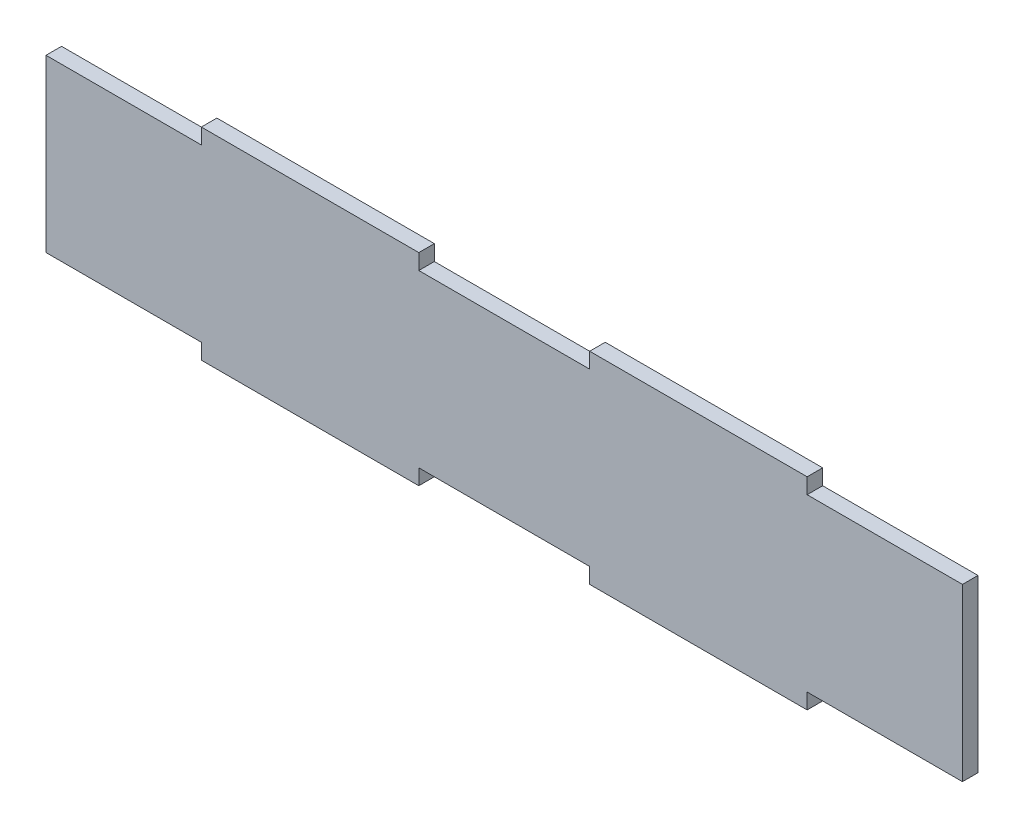
ISO-10303-21;
HEADER;
FILE_DESCRIPTION(('STEP AP214'),'2;1');
FILE_NAME('part.step','',(''),(''),'','','');
FILE_SCHEMA(('AUTOMOTIVE_DESIGN { 1 0 10303 214 1 1 1 1 }'));
ENDSEC;
DATA;
#1=APPLICATION_CONTEXT('core data for automotive mechanical design processes');
#2=APPLICATION_PROTOCOL_DEFINITION('international standard','automotive_design',2000,#1);
#3=PRODUCT_CONTEXT('',#1,'mechanical');
#4=PRODUCT('Part','Part','',(#3));
#5=PRODUCT_RELATED_PRODUCT_CATEGORY('part','',(#4));
#6=PRODUCT_DEFINITION_FORMATION('','',#4);
#7=PRODUCT_DEFINITION_CONTEXT('part definition',#1,'design');
#8=PRODUCT_DEFINITION('design','',#6,#7);
#9=PRODUCT_DEFINITION_SHAPE('','',#8);
#10=(LENGTH_UNIT() NAMED_UNIT(*) SI_UNIT(.MILLI.,.METRE.));
#11=(NAMED_UNIT(*) PLANE_ANGLE_UNIT() SI_UNIT($,.RADIAN.));
#12=(NAMED_UNIT(*) SI_UNIT($,.STERADIAN.) SOLID_ANGLE_UNIT());
#13=UNCERTAINTY_MEASURE_WITH_UNIT(LENGTH_MEASURE(1.E-05),#10,'distance_accuracy_value','');
#14=(GEOMETRIC_REPRESENTATION_CONTEXT(3) GLOBAL_UNCERTAINTY_ASSIGNED_CONTEXT((#13)) GLOBAL_UNIT_ASSIGNED_CONTEXT((#10,
#11,#12)) REPRESENTATION_CONTEXT('',''));
#15=CARTESIAN_POINT('',(0.,0.,0.));
#16=DIRECTION('',(0.,0.,1.));
#17=DIRECTION('',(1.,0.,0.));
#18=AXIS2_PLACEMENT_3D('',#15,#16,#17);
#19=CARTESIAN_POINT('',(0.,0.,5.));
#20=DIRECTION('',(0.,-1.,0.));
#21=DIRECTION('',(1.,0.,0.));
#22=AXIS2_PLACEMENT_3D('',#19,#20,#21);
#23=PLANE('',#22);
#24=DIRECTION('',(-1.,0.,0.));
#25=VECTOR('',#24,1.);
#26=CARTESIAN_POINT('',(0.,0.,0.));
#27=LINE('',#26,#25);
#28=CARTESIAN_POINT('',(0.,0.,0.));
#29=VERTEX_POINT('',#28);
#30=CARTESIAN_POINT('',(-50.,0.,0.));
#31=VERTEX_POINT('',#30);
#32=EDGE_CURVE('E315',#29,#31,#27,.T.);
#33=ORIENTED_EDGE('',*,*,#32,.T.);
#34=DIRECTION('',(0.,0.,-1.));
#35=VECTOR('',#34,1.);
#36=CARTESIAN_POINT('',(-50.,0.,5.));
#37=LINE('',#36,#35);
#38=CARTESIAN_POINT('',(-50.,0.,5.));
#39=VERTEX_POINT('',#38);
#40=EDGE_CURVE('E11',#39,#31,#37,.T.);
#41=ORIENTED_EDGE('',*,*,#40,.F.);
#42=DIRECTION('',(-1.,0.,0.));
#43=VECTOR('',#42,1.);
#44=CARTESIAN_POINT('',(0.,0.,5.));
#45=LINE('',#44,#43);
#46=CARTESIAN_POINT('',(0.,0.,5.));
#47=VERTEX_POINT('',#46);
#48=EDGE_CURVE('E220',#47,#39,#45,.T.);
#49=ORIENTED_EDGE('',*,*,#48,.F.);
#50=DIRECTION('',(0.,0.,-1.));
#51=VECTOR('',#50,1.);
#52=CARTESIAN_POINT('',(0.,0.,5.));
#53=LINE('',#52,#51);
#54=EDGE_CURVE('E51',#47,#29,#53,.T.);
#55=ORIENTED_EDGE('',*,*,#54,.T.);
#56=EDGE_LOOP('',(#33,#41,#49,#55));
#57=FACE_BOUND('',#56,.T.);
#58=ADVANCED_FACE('F34',(#57),#23,.F.);
#59=CARTESIAN_POINT('',(-50.,0.,5.));
#60=DIRECTION('',(-1.,0.,0.));
#61=DIRECTION('',(0.,-1.,0.));
#62=AXIS2_PLACEMENT_3D('',#59,#60,#61);
#63=PLANE('',#62);
#64=DIRECTION('',(0.,1.,0.));
#65=VECTOR('',#64,1.);
#66=CARTESIAN_POINT('',(-50.,0.,0.));
#67=LINE('',#66,#65);
#68=CARTESIAN_POINT('',(-50.,4.99999999999999,0.));
#69=VERTEX_POINT('',#68);
#70=EDGE_CURVE('E310',#31,#69,#67,.T.);
#71=ORIENTED_EDGE('',*,*,#70,.T.);
#72=DIRECTION('',(0.,0.,-1.));
#73=VECTOR('',#72,1.);
#74=CARTESIAN_POINT('',(-50.,4.99999999999999,5.));
#75=LINE('',#74,#73);
#76=CARTESIAN_POINT('',(-50.,4.99999999999999,5.));
#77=VERTEX_POINT('',#76);
#78=EDGE_CURVE('E43',#77,#69,#75,.T.);
#79=ORIENTED_EDGE('',*,*,#78,.F.);
#80=DIRECTION('',(0.,1.,0.));
#81=VECTOR('',#80,1.);
#82=CARTESIAN_POINT('',(-50.,0.,5.));
#83=LINE('',#82,#81);
#84=EDGE_CURVE('E125',#39,#77,#83,.T.);
#85=ORIENTED_EDGE('',*,*,#84,.F.);
#86=ORIENTED_EDGE('',*,*,#40,.T.);
#87=EDGE_LOOP('',(#71,#79,#85,#86));
#88=FACE_BOUND('',#87,.T.);
#89=ADVANCED_FACE('F36',(#88),#63,.F.);
#90=CARTESIAN_POINT('',(0.,5.,5.));
#91=DIRECTION('',(0.,-1.,0.));
#92=DIRECTION('',(1.,0.,0.));
#93=AXIS2_PLACEMENT_3D('',#90,#91,#92);
#94=PLANE('',#93);
#95=DIRECTION('',(-1.,0.,0.));
#96=VECTOR('',#95,1.);
#97=CARTESIAN_POINT('',(0.,5.,0.));
#98=LINE('',#97,#96);
#99=CARTESIAN_POINT('',(-120.,4.99999999999999,0.));
#100=VERTEX_POINT('',#99);
#101=EDGE_CURVE('E306',#69,#100,#98,.T.);
#102=ORIENTED_EDGE('',*,*,#101,.T.);
#103=DIRECTION('',(0.,0.,-1.));
#104=VECTOR('',#103,1.);
#105=CARTESIAN_POINT('',(-120.,4.99999999999999,5.));
#106=LINE('',#105,#104);
#107=CARTESIAN_POINT('',(-120.,4.99999999999999,5.));
#108=VERTEX_POINT('',#107);
#109=EDGE_CURVE('E298',#108,#100,#106,.T.);
#110=ORIENTED_EDGE('',*,*,#109,.F.);
#111=DIRECTION('',(-1.,0.,0.));
#112=VECTOR('',#111,1.);
#113=CARTESIAN_POINT('',(0.,5.,5.));
#114=LINE('',#113,#112);
#115=EDGE_CURVE('E232',#77,#108,#114,.T.);
#116=ORIENTED_EDGE('',*,*,#115,.F.);
#117=ORIENTED_EDGE('',*,*,#78,.T.);
#118=EDGE_LOOP('',(#102,#110,#116,#117));
#119=FACE_BOUND('',#118,.T.);
#120=ADVANCED_FACE('F304',(#119),#94,.F.);
#121=CARTESIAN_POINT('',(-120.,0.,5.));
#122=DIRECTION('',(-1.,0.,0.));
#123=DIRECTION('',(0.,0.,1.));
#124=AXIS2_PLACEMENT_3D('',#121,#122,#123);
#125=PLANE('',#124);
#126=DIRECTION('',(0.,1.,0.));
#127=VECTOR('',#126,1.);
#128=CARTESIAN_POINT('',(-120.,0.,0.));
#129=LINE('',#128,#127);
#130=CARTESIAN_POINT('',(-120.,0.,0.));
#131=VERTEX_POINT('',#130);
#132=EDGE_CURVE('E312',#131,#100,#129,.T.);
#133=ORIENTED_EDGE('',*,*,#132,.F.);
#134=DIRECTION('',(0.,0.,-1.));
#135=VECTOR('',#134,1.);
#136=CARTESIAN_POINT('',(-120.,0.,5.));
#137=LINE('',#136,#135);
#138=CARTESIAN_POINT('',(-120.,0.,5.));
#139=VERTEX_POINT('',#138);
#140=EDGE_CURVE('E254',#139,#131,#137,.T.);
#141=ORIENTED_EDGE('',*,*,#140,.F.);
#142=DIRECTION('',(0.,1.,0.));
#143=VECTOR('',#142,1.);
#144=CARTESIAN_POINT('',(-120.,0.,5.));
#145=LINE('',#144,#143);
#146=EDGE_CURVE('E229',#139,#108,#145,.T.);
#147=ORIENTED_EDGE('',*,*,#146,.T.);
#148=ORIENTED_EDGE('',*,*,#109,.T.);
#149=EDGE_LOOP('',(#133,#141,#147,#148));
#150=FACE_BOUND('',#149,.T.);
#151=ADVANCED_FACE('F395',(#150),#125,.T.);
#152=CARTESIAN_POINT('',(-175.,0.,0.));
#153=VERTEX_POINT('',#152);
#154=EDGE_CURVE('E250',#131,#153,#27,.T.);
#155=ORIENTED_EDGE('',*,*,#154,.T.);
#156=DIRECTION('',(0.,0.,-1.));
#157=VECTOR('',#156,1.);
#158=CARTESIAN_POINT('',(-175.,0.,5.));
#159=LINE('',#158,#157);
#160=CARTESIAN_POINT('',(-175.,0.,5.));
#161=VERTEX_POINT('',#160);
#162=EDGE_CURVE('E247',#161,#153,#159,.T.);
#163=ORIENTED_EDGE('',*,*,#162,.F.);
#164=EDGE_CURVE('E219',#139,#161,#45,.T.);
#165=ORIENTED_EDGE('',*,*,#164,.F.);
#166=ORIENTED_EDGE('',*,*,#140,.T.);
#167=EDGE_LOOP('',(#155,#163,#165,#166));
#168=FACE_BOUND('',#167,.T.);
#169=ADVANCED_FACE('F248',(#168),#23,.F.);
#170=CARTESIAN_POINT('',(-175.,0.,5.));
#171=DIRECTION('',(-1.,0.,0.));
#172=DIRECTION('',(0.,0.,1.));
#173=AXIS2_PLACEMENT_3D('',#170,#171,#172);
#174=PLANE('',#173);
#175=DIRECTION('',(0.,1.,0.));
#176=VECTOR('',#175,1.);
#177=CARTESIAN_POINT('',(-175.,0.,0.));
#178=LINE('',#177,#176);
#179=CARTESIAN_POINT('',(-175.,4.99999999999999,0.));
#180=VERTEX_POINT('',#179);
#181=EDGE_CURVE('E258',#153,#180,#178,.T.);
#182=ORIENTED_EDGE('',*,*,#181,.T.);
#183=DIRECTION('',(0.,0.,-1.));
#184=VECTOR('',#183,1.);
#185=CARTESIAN_POINT('',(-175.,4.99999999999999,5.));
#186=LINE('',#185,#184);
#187=CARTESIAN_POINT('',(-175.,4.99999999999999,5.));
#188=VERTEX_POINT('',#187);
#189=EDGE_CURVE('E255',#188,#180,#186,.T.);
#190=ORIENTED_EDGE('',*,*,#189,.F.);
#191=DIRECTION('',(0.,1.,0.));
#192=VECTOR('',#191,1.);
#193=CARTESIAN_POINT('',(-175.,0.,5.));
#194=LINE('',#193,#192);
#195=EDGE_CURVE('E227',#161,#188,#194,.T.);
#196=ORIENTED_EDGE('',*,*,#195,.F.);
#197=ORIENTED_EDGE('',*,*,#162,.T.);
#198=EDGE_LOOP('',(#182,#190,#196,#197));
#199=FACE_BOUND('',#198,.T.);
#200=ADVANCED_FACE('F257',(#199),#174,.F.);
#201=CARTESIAN_POINT('',(0.,4.99999999999997,5.));
#202=DIRECTION('',(0.,1.,0.));
#203=DIRECTION('',(-1.,0.,0.));
#204=AXIS2_PLACEMENT_3D('',#201,#202,#203);
#205=PLANE('',#204);
#206=DIRECTION('',(1.,0.,0.));
#207=VECTOR('',#206,1.);
#208=CARTESIAN_POINT('',(0.,4.99999999999997,0.));
#209=LINE('',#208,#207);
#210=CARTESIAN_POINT('',(-245.,4.99999999999999,0.));
#211=VERTEX_POINT('',#210);
#212=EDGE_CURVE('E320',#211,#180,#209,.T.);
#213=ORIENTED_EDGE('',*,*,#212,.F.);
#214=DIRECTION('',(0.,0.,-1.));
#215=VECTOR('',#214,1.);
#216=CARTESIAN_POINT('',(-245.,4.99999999999999,5.));
#217=LINE('',#216,#215);
#218=CARTESIAN_POINT('',(-245.,4.99999999999999,5.));
#219=VERTEX_POINT('',#218);
#220=EDGE_CURVE('E262',#219,#211,#217,.T.);
#221=ORIENTED_EDGE('',*,*,#220,.F.);
#222=DIRECTION('',(1.,0.,0.));
#223=VECTOR('',#222,1.);
#224=CARTESIAN_POINT('',(0.,4.99999999999997,5.));
#225=LINE('',#224,#223);
#226=EDGE_CURVE('E224',#219,#188,#225,.T.);
#227=ORIENTED_EDGE('',*,*,#226,.T.);
#228=ORIENTED_EDGE('',*,*,#189,.T.);
#229=EDGE_LOOP('',(#213,#221,#227,#228));
#230=FACE_BOUND('',#229,.T.);
#231=ADVANCED_FACE('F264',(#230),#205,.T.);
#232=CARTESIAN_POINT('',(-245.,1.36002320516582E-12,5.));
#233=DIRECTION('',(-1.,0.,0.));
#234=DIRECTION('',(0.,-1.,0.));
#235=AXIS2_PLACEMENT_3D('',#232,#233,#234);
#236=PLANE('',#235);
#237=DIRECTION('',(0.,1.,0.));
#238=VECTOR('',#237,1.);
#239=CARTESIAN_POINT('',(-245.,1.36002320516582E-12,0.));
#240=LINE('',#239,#238);
#241=CARTESIAN_POINT('',(-245.,0.,0.));
#242=VERTEX_POINT('',#241);
#243=EDGE_CURVE('E272',#242,#211,#240,.T.);
#244=ORIENTED_EDGE('',*,*,#243,.F.);
#245=DIRECTION('',(0.,0.,-1.));
#246=VECTOR('',#245,1.);
#247=CARTESIAN_POINT('',(-245.,0.,5.));
#248=LINE('',#247,#246);
#249=CARTESIAN_POINT('',(-245.,0.,5.));
#250=VERTEX_POINT('',#249);
#251=EDGE_CURVE('E269',#250,#242,#248,.T.);
#252=ORIENTED_EDGE('',*,*,#251,.F.);
#253=DIRECTION('',(0.,1.,0.));
#254=VECTOR('',#253,1.);
#255=CARTESIAN_POINT('',(-245.,1.36002320516582E-12,5.));
#256=LINE('',#255,#254);
#257=EDGE_CURVE('E217',#250,#219,#256,.T.);
#258=ORIENTED_EDGE('',*,*,#257,.T.);
#259=ORIENTED_EDGE('',*,*,#220,.T.);
#260=EDGE_LOOP('',(#244,#252,#258,#259));
#261=FACE_BOUND('',#260,.T.);
#262=ADVANCED_FACE('F268',(#261),#236,.T.);
#263=CARTESIAN_POINT('',(-295.,0.,0.));
#264=VERTEX_POINT('',#263);
#265=EDGE_CURVE('E280',#242,#264,#27,.T.);
#266=ORIENTED_EDGE('',*,*,#265,.T.);
#267=DIRECTION('',(0.,0.,-1.));
#268=VECTOR('',#267,1.);
#269=CARTESIAN_POINT('',(-295.,0.,5.));
#270=LINE('',#269,#268);
#271=CARTESIAN_POINT('',(-295.,0.,5.));
#272=VERTEX_POINT('',#271);
#273=EDGE_CURVE('E275',#272,#264,#270,.T.);
#274=ORIENTED_EDGE('',*,*,#273,.F.);
#275=EDGE_CURVE('E214',#250,#272,#45,.T.);
#276=ORIENTED_EDGE('',*,*,#275,.F.);
#277=ORIENTED_EDGE('',*,*,#251,.T.);
#278=EDGE_LOOP('',(#266,#274,#276,#277));
#279=FACE_BOUND('',#278,.T.);
#280=ADVANCED_FACE('F278',(#279),#23,.F.);
#281=CARTESIAN_POINT('',(-295.,0.,5.));
#282=DIRECTION('',(1.,0.,0.));
#283=DIRECTION('',(0.,0.,-1.));
#284=AXIS2_PLACEMENT_3D('',#281,#282,#283);
#285=PLANE('',#284);
#286=DIRECTION('',(0.,-1.,0.));
#287=VECTOR('',#286,1.);
#288=CARTESIAN_POINT('',(-295.,0.,0.));
#289=LINE('',#288,#287);
#290=CARTESIAN_POINT('',(-295.,-55.,0.));
#291=VERTEX_POINT('',#290);
#292=EDGE_CURVE('E287',#264,#291,#289,.T.);
#293=ORIENTED_EDGE('',*,*,#292,.T.);
#294=DIRECTION('',(0.,0.,-1.));
#295=VECTOR('',#294,1.);
#296=CARTESIAN_POINT('',(-295.,-55.,5.));
#297=LINE('',#296,#295);
#298=CARTESIAN_POINT('',(-295.,-55.,5.));
#299=VERTEX_POINT('',#298);
#300=EDGE_CURVE('E284',#299,#291,#297,.T.);
#301=ORIENTED_EDGE('',*,*,#300,.F.);
#302=DIRECTION('',(0.,-1.,0.));
#303=VECTOR('',#302,1.);
#304=CARTESIAN_POINT('',(-295.,0.,5.));
#305=LINE('',#304,#303);
#306=EDGE_CURVE('E210',#272,#299,#305,.T.);
#307=ORIENTED_EDGE('',*,*,#306,.F.);
#308=ORIENTED_EDGE('',*,*,#273,.T.);
#309=EDGE_LOOP('',(#293,#301,#307,#308));
#310=FACE_BOUND('',#309,.T.);
#311=ADVANCED_FACE('F286',(#310),#285,.F.);
#312=CARTESIAN_POINT('',(0.,-55.,5.));
#313=DIRECTION('',(0.,-1.,0.));
#314=DIRECTION('',(1.,0.,0.));
#315=AXIS2_PLACEMENT_3D('',#312,#313,#314);
#316=PLANE('',#315);
#317=DIRECTION('',(-1.,0.,0.));
#318=VECTOR('',#317,1.);
#319=CARTESIAN_POINT('',(0.,-55.,0.));
#320=LINE('',#319,#318);
#321=CARTESIAN_POINT('',(-245.,-55.,0.));
#322=VERTEX_POINT('',#321);
#323=EDGE_CURVE('E324',#322,#291,#320,.T.);
#324=ORIENTED_EDGE('',*,*,#323,.F.);
#325=DIRECTION('',(0.,0.,-1.));
#326=VECTOR('',#325,1.);
#327=CARTESIAN_POINT('',(-245.,-55.,5.));
#328=LINE('',#327,#326);
#329=CARTESIAN_POINT('',(-245.,-55.,5.));
#330=VERTEX_POINT('',#329);
#331=EDGE_CURVE('E290',#330,#322,#328,.T.);
#332=ORIENTED_EDGE('',*,*,#331,.F.);
#333=DIRECTION('',(-1.,0.,0.));
#334=VECTOR('',#333,1.);
#335=CARTESIAN_POINT('',(0.,-55.,5.));
#336=LINE('',#335,#334);
#337=EDGE_CURVE('E201',#330,#299,#336,.T.);
#338=ORIENTED_EDGE('',*,*,#337,.T.);
#339=ORIENTED_EDGE('',*,*,#300,.T.);
#340=EDGE_LOOP('',(#324,#332,#338,#339));
#341=FACE_BOUND('',#340,.T.);
#342=ADVANCED_FACE('F384',(#341),#316,.T.);
#343=CARTESIAN_POINT('',(-245.,-1.36002320516582E-12,5.));
#344=DIRECTION('',(1.,0.,0.));
#345=DIRECTION('',(0.,1.,0.));
#346=AXIS2_PLACEMENT_3D('',#343,#344,#345);
#347=PLANE('',#346);
#348=DIRECTION('',(0.,-1.,0.));
#349=VECTOR('',#348,1.);
#350=CARTESIAN_POINT('',(-245.,-1.36002320516582E-12,0.));
#351=LINE('',#350,#349);
#352=CARTESIAN_POINT('',(-245.,-60.,0.));
#353=VERTEX_POINT('',#352);
#354=EDGE_CURVE('E326',#322,#353,#351,.T.);
#355=ORIENTED_EDGE('',*,*,#354,.T.);
#356=DIRECTION('',(0.,0.,-1.));
#357=VECTOR('',#356,1.);
#358=CARTESIAN_POINT('',(-245.,-60.,5.));
#359=LINE('',#358,#357);
#360=CARTESIAN_POINT('',(-245.,-60.,5.));
#361=VERTEX_POINT('',#360);
#362=EDGE_CURVE('E292',#361,#353,#359,.T.);
#363=ORIENTED_EDGE('',*,*,#362,.F.);
#364=DIRECTION('',(0.,-1.,0.));
#365=VECTOR('',#364,1.);
#366=CARTESIAN_POINT('',(-245.,-1.36002320516582E-12,5.));
#367=LINE('',#366,#365);
#368=EDGE_CURVE('E209',#330,#361,#367,.T.);
#369=ORIENTED_EDGE('',*,*,#368,.F.);
#370=ORIENTED_EDGE('',*,*,#331,.T.);
#371=EDGE_LOOP('',(#355,#363,#369,#370));
#372=FACE_BOUND('',#371,.T.);
#373=ADVANCED_FACE('F457',(#372),#347,.F.);
#374=CARTESIAN_POINT('',(0.,-60.,5.));
#375=DIRECTION('',(0.,1.,0.));
#376=DIRECTION('',(-1.,0.,0.));
#377=AXIS2_PLACEMENT_3D('',#374,#375,#376);
#378=PLANE('',#377);
#379=DIRECTION('',(1.,0.,0.));
#380=VECTOR('',#379,1.);
#381=CARTESIAN_POINT('',(0.,-60.,0.));
#382=LINE('',#381,#380);
#383=CARTESIAN_POINT('',(-175.,-60.,0.));
#384=VERTEX_POINT('',#383);
#385=EDGE_CURVE('E329',#353,#384,#382,.T.);
#386=ORIENTED_EDGE('',*,*,#385,.T.);
#387=DIRECTION('',(0.,0.,-1.));
#388=VECTOR('',#387,1.);
#389=CARTESIAN_POINT('',(-175.,-60.,5.));
#390=LINE('',#389,#388);
#391=CARTESIAN_POINT('',(-175.,-60.,5.));
#392=VERTEX_POINT('',#391);
#393=EDGE_CURVE('E351',#392,#384,#390,.T.);
#394=ORIENTED_EDGE('',*,*,#393,.F.);
#395=DIRECTION('',(1.,0.,0.));
#396=VECTOR('',#395,1.);
#397=CARTESIAN_POINT('',(0.,-60.,5.));
#398=LINE('',#397,#396);
#399=EDGE_CURVE('E213',#361,#392,#398,.T.);
#400=ORIENTED_EDGE('',*,*,#399,.F.);
#401=ORIENTED_EDGE('',*,*,#362,.T.);
#402=EDGE_LOOP('',(#386,#394,#400,#401));
#403=FACE_BOUND('',#402,.T.);
#404=ADVANCED_FACE('F357',(#403),#378,.F.);
#405=CARTESIAN_POINT('',(-175.,0.,5.));
#406=DIRECTION('',(1.,0.,0.));
#407=DIRECTION('',(0.,0.,-1.));
#408=AXIS2_PLACEMENT_3D('',#405,#406,#407);
#409=PLANE('',#408);
#410=DIRECTION('',(0.,-1.,0.));
#411=VECTOR('',#410,1.);
#412=CARTESIAN_POINT('',(-175.,0.,0.));
#413=LINE('',#412,#411);
#414=CARTESIAN_POINT('',(-175.,-55.,0.));
#415=VERTEX_POINT('',#414);
#416=EDGE_CURVE('E332',#415,#384,#413,.T.);
#417=ORIENTED_EDGE('',*,*,#416,.F.);
#418=DIRECTION('',(0.,0.,-1.));
#419=VECTOR('',#418,1.);
#420=CARTESIAN_POINT('',(-175.,-55.,5.));
#421=LINE('',#420,#419);
#422=CARTESIAN_POINT('',(-175.,-55.,5.));
#423=VERTEX_POINT('',#422);
#424=EDGE_CURVE('E349',#423,#415,#421,.T.);
#425=ORIENTED_EDGE('',*,*,#424,.F.);
#426=DIRECTION('',(0.,-1.,0.));
#427=VECTOR('',#426,1.);
#428=CARTESIAN_POINT('',(-175.,0.,5.));
#429=LINE('',#428,#427);
#430=EDGE_CURVE('E207',#423,#392,#429,.T.);
#431=ORIENTED_EDGE('',*,*,#430,.T.);
#432=ORIENTED_EDGE('',*,*,#393,.T.);
#433=EDGE_LOOP('',(#417,#425,#431,#432));
#434=FACE_BOUND('',#433,.T.);
#435=ADVANCED_FACE('F367',(#434),#409,.T.);
#436=CARTESIAN_POINT('',(-120.,-55.,0.));
#437=VERTEX_POINT('',#436);
#438=EDGE_CURVE('E327',#437,#415,#320,.T.);
#439=ORIENTED_EDGE('',*,*,#438,.F.);
#440=DIRECTION('',(0.,0.,-1.));
#441=VECTOR('',#440,1.);
#442=CARTESIAN_POINT('',(-120.,-55.,5.));
#443=LINE('',#442,#441);
#444=CARTESIAN_POINT('',(-120.,-55.,5.));
#445=VERTEX_POINT('',#444);
#446=EDGE_CURVE('E347',#445,#437,#443,.T.);
#447=ORIENTED_EDGE('',*,*,#446,.F.);
#448=EDGE_CURVE('E200',#445,#423,#336,.T.);
#449=ORIENTED_EDGE('',*,*,#448,.T.);
#450=ORIENTED_EDGE('',*,*,#424,.T.);
#451=EDGE_LOOP('',(#439,#447,#449,#450));
#452=FACE_BOUND('',#451,.T.);
#453=ADVANCED_FACE('F385',(#452),#316,.T.);
#454=CARTESIAN_POINT('',(-120.,0.,5.));
#455=DIRECTION('',(1.,0.,0.));
#456=DIRECTION('',(0.,0.,-1.));
#457=AXIS2_PLACEMENT_3D('',#454,#455,#456);
#458=PLANE('',#457);
#459=DIRECTION('',(0.,-1.,0.));
#460=VECTOR('',#459,1.);
#461=CARTESIAN_POINT('',(-120.,0.,0.));
#462=LINE('',#461,#460);
#463=CARTESIAN_POINT('',(-120.,-60.,0.));
#464=VERTEX_POINT('',#463);
#465=EDGE_CURVE('E335',#437,#464,#462,.T.);
#466=ORIENTED_EDGE('',*,*,#465,.T.);
#467=DIRECTION('',(0.,0.,-1.));
#468=VECTOR('',#467,1.);
#469=CARTESIAN_POINT('',(-120.,-60.,5.));
#470=LINE('',#469,#468);
#471=CARTESIAN_POINT('',(-120.,-60.,5.));
#472=VERTEX_POINT('',#471);
#473=EDGE_CURVE('E345',#472,#464,#470,.T.);
#474=ORIENTED_EDGE('',*,*,#473,.F.);
#475=DIRECTION('',(0.,-1.,0.));
#476=VECTOR('',#475,1.);
#477=CARTESIAN_POINT('',(-120.,0.,5.));
#478=LINE('',#477,#476);
#479=EDGE_CURVE('E206',#445,#472,#478,.T.);
#480=ORIENTED_EDGE('',*,*,#479,.F.);
#481=ORIENTED_EDGE('',*,*,#446,.T.);
#482=EDGE_LOOP('',(#466,#474,#480,#481));
#483=FACE_BOUND('',#482,.T.);
#484=ADVANCED_FACE('F491',(#483),#458,.F.);
#485=CARTESIAN_POINT('',(0.,-60.,5.));
#486=DIRECTION('',(0.,-1.,0.));
#487=DIRECTION('',(1.,0.,0.));
#488=AXIS2_PLACEMENT_3D('',#485,#486,#487);
#489=PLANE('',#488);
#490=DIRECTION('',(-1.,0.,0.));
#491=VECTOR('',#490,1.);
#492=CARTESIAN_POINT('',(0.,-60.,0.));
#493=LINE('',#492,#491);
#494=CARTESIAN_POINT('',(-50.,-60.,0.));
#495=VERTEX_POINT('',#494);
#496=EDGE_CURVE('E338',#495,#464,#493,.T.);
#497=ORIENTED_EDGE('',*,*,#496,.F.);
#498=DIRECTION('',(0.,0.,-1.));
#499=VECTOR('',#498,1.);
#500=CARTESIAN_POINT('',(-50.,-60.,5.));
#501=LINE('',#500,#499);
#502=CARTESIAN_POINT('',(-50.,-60.,5.));
#503=VERTEX_POINT('',#502);
#504=EDGE_CURVE('E186',#503,#495,#501,.T.);
#505=ORIENTED_EDGE('',*,*,#504,.F.);
#506=DIRECTION('',(-1.,0.,0.));
#507=VECTOR('',#506,1.);
#508=CARTESIAN_POINT('',(0.,-60.,5.));
#509=LINE('',#508,#507);
#510=EDGE_CURVE('E195',#503,#472,#509,.T.);
#511=ORIENTED_EDGE('',*,*,#510,.T.);
#512=ORIENTED_EDGE('',*,*,#473,.T.);
#513=EDGE_LOOP('',(#497,#505,#511,#512));
#514=FACE_BOUND('',#513,.T.);
#515=ADVANCED_FACE('F501',(#514),#489,.T.);
#516=CARTESIAN_POINT('',(-49.9999999999999,0.,5.));
#517=DIRECTION('',(1.,0.,0.));
#518=DIRECTION('',(0.,1.,0.));
#519=AXIS2_PLACEMENT_3D('',#516,#517,#518);
#520=PLANE('',#519);
#521=DIRECTION('',(0.,-1.,0.));
#522=VECTOR('',#521,1.);
#523=CARTESIAN_POINT('',(-49.9999999999999,0.,0.));
#524=LINE('',#523,#522);
#525=CARTESIAN_POINT('',(-50.,-55.,0.));
#526=VERTEX_POINT('',#525);
#527=EDGE_CURVE('E182',#526,#495,#524,.T.);
#528=ORIENTED_EDGE('',*,*,#527,.F.);
#529=DIRECTION('',(0.,0.,-1.));
#530=VECTOR('',#529,1.);
#531=CARTESIAN_POINT('',(-50.,-55.,5.));
#532=LINE('',#531,#530);
#533=CARTESIAN_POINT('',(-50.,-55.,5.));
#534=VERTEX_POINT('',#533);
#535=EDGE_CURVE('E177',#534,#526,#532,.T.);
#536=ORIENTED_EDGE('',*,*,#535,.F.);
#537=DIRECTION('',(0.,-1.,0.));
#538=VECTOR('',#537,1.);
#539=CARTESIAN_POINT('',(-49.9999999999999,0.,5.));
#540=LINE('',#539,#538);
#541=EDGE_CURVE('E180',#534,#503,#540,.T.);
#542=ORIENTED_EDGE('',*,*,#541,.T.);
#543=ORIENTED_EDGE('',*,*,#504,.T.);
#544=EDGE_LOOP('',(#528,#536,#542,#543));
#545=FACE_BOUND('',#544,.T.);
#546=ADVANCED_FACE('F179',(#545),#520,.T.);
#547=CARTESIAN_POINT('',(0.,-55.,0.));
#548=VERTEX_POINT('',#547);
#549=EDGE_CURVE('E237',#548,#526,#320,.T.);
#550=ORIENTED_EDGE('',*,*,#549,.F.);
#551=DIRECTION('',(0.,0.,-1.));
#552=VECTOR('',#551,1.);
#553=CARTESIAN_POINT('',(0.,-55.,5.));
#554=LINE('',#553,#552);
#555=CARTESIAN_POINT('',(0.,-55.,5.));
#556=VERTEX_POINT('',#555);
#557=EDGE_CURVE('E113',#556,#548,#554,.T.);
#558=ORIENTED_EDGE('',*,*,#557,.F.);
#559=EDGE_CURVE('E193',#556,#534,#336,.T.);
#560=ORIENTED_EDGE('',*,*,#559,.T.);
#561=ORIENTED_EDGE('',*,*,#535,.T.);
#562=EDGE_LOOP('',(#550,#558,#560,#561));
#563=FACE_BOUND('',#562,.T.);
#564=ADVANCED_FACE('F197',(#563),#316,.T.);
#565=CARTESIAN_POINT('',(0.,0.,5.));
#566=DIRECTION('',(1.,0.,0.));
#567=DIRECTION('',(0.,0.,-1.));
#568=AXIS2_PLACEMENT_3D('',#565,#566,#567);
#569=PLANE('',#568);
#570=DIRECTION('',(0.,-1.,0.));
#571=VECTOR('',#570,1.);
#572=CARTESIAN_POINT('',(0.,0.,0.));
#573=LINE('',#572,#571);
#574=EDGE_CURVE('E234',#29,#548,#573,.T.);
#575=ORIENTED_EDGE('',*,*,#574,.F.);
#576=ORIENTED_EDGE('',*,*,#54,.F.);
#577=DIRECTION('',(0.,-1.,0.));
#578=VECTOR('',#577,1.);
#579=CARTESIAN_POINT('',(0.,0.,5.));
#580=LINE('',#579,#578);
#581=EDGE_CURVE('E198',#47,#556,#580,.T.);
#582=ORIENTED_EDGE('',*,*,#581,.T.);
#583=ORIENTED_EDGE('',*,*,#557,.T.);
#584=EDGE_LOOP('',(#575,#576,#582,#583));
#585=FACE_BOUND('',#584,.T.);
#586=ADVANCED_FACE('F375',(#585),#569,.T.);
#587=CARTESIAN_POINT('',(0.,0.,5.));
#588=DIRECTION('',(0.,0.,1.));
#589=DIRECTION('',(1.,0.,0.));
#590=AXIS2_PLACEMENT_3D('',#587,#588,#589);
#591=PLANE('',#590);
#592=ORIENTED_EDGE('',*,*,#48,.T.);
#593=ORIENTED_EDGE('',*,*,#84,.T.);
#594=ORIENTED_EDGE('',*,*,#115,.T.);
#595=ORIENTED_EDGE('',*,*,#146,.F.);
#596=ORIENTED_EDGE('',*,*,#164,.T.);
#597=ORIENTED_EDGE('',*,*,#195,.T.);
#598=ORIENTED_EDGE('',*,*,#226,.F.);
#599=ORIENTED_EDGE('',*,*,#257,.F.);
#600=ORIENTED_EDGE('',*,*,#275,.T.);
#601=ORIENTED_EDGE('',*,*,#306,.T.);
#602=ORIENTED_EDGE('',*,*,#337,.F.);
#603=ORIENTED_EDGE('',*,*,#368,.T.);
#604=ORIENTED_EDGE('',*,*,#399,.T.);
#605=ORIENTED_EDGE('',*,*,#430,.F.);
#606=ORIENTED_EDGE('',*,*,#448,.F.);
#607=ORIENTED_EDGE('',*,*,#479,.T.);
#608=ORIENTED_EDGE('',*,*,#510,.F.);
#609=ORIENTED_EDGE('',*,*,#541,.F.);
#610=ORIENTED_EDGE('',*,*,#559,.F.);
#611=ORIENTED_EDGE('',*,*,#581,.F.);
#612=EDGE_LOOP('',(#592,#593,#594,#595,#596,#597,#598,#599,#600,#601,#602,#603,#604,#605,#606,
#607,#608,#609,#610,#611));
#613=FACE_BOUND('',#612,.T.);
#614=ADVANCED_FACE('F191',(#613),#591,.T.);
#615=CARTESIAN_POINT('',(0.,0.,0.));
#616=DIRECTION('',(0.,0.,1.));
#617=DIRECTION('',(1.,0.,0.));
#618=AXIS2_PLACEMENT_3D('',#615,#616,#617);
#619=PLANE('',#618);
#620=ORIENTED_EDGE('',*,*,#32,.F.);
#621=ORIENTED_EDGE('',*,*,#574,.T.);
#622=ORIENTED_EDGE('',*,*,#549,.T.);
#623=ORIENTED_EDGE('',*,*,#527,.T.);
#624=ORIENTED_EDGE('',*,*,#496,.T.);
#625=ORIENTED_EDGE('',*,*,#465,.F.);
#626=ORIENTED_EDGE('',*,*,#438,.T.);
#627=ORIENTED_EDGE('',*,*,#416,.T.);
#628=ORIENTED_EDGE('',*,*,#385,.F.);
#629=ORIENTED_EDGE('',*,*,#354,.F.);
#630=ORIENTED_EDGE('',*,*,#323,.T.);
#631=ORIENTED_EDGE('',*,*,#292,.F.);
#632=ORIENTED_EDGE('',*,*,#265,.F.);
#633=ORIENTED_EDGE('',*,*,#243,.T.);
#634=ORIENTED_EDGE('',*,*,#212,.T.);
#635=ORIENTED_EDGE('',*,*,#181,.F.);
#636=ORIENTED_EDGE('',*,*,#154,.F.);
#637=ORIENTED_EDGE('',*,*,#132,.T.);
#638=ORIENTED_EDGE('',*,*,#101,.F.);
#639=ORIENTED_EDGE('',*,*,#70,.F.);
#640=EDGE_LOOP('',(#620,#621,#622,#623,#624,#625,#626,#627,#628,#629,#630,#631,#632,#633,#634,
#635,#636,#637,#638,#639));
#641=FACE_BOUND('',#640,.T.);
#642=ADVANCED_FACE('F309',(#641),#619,.F.);
#643=CLOSED_SHELL('',(#58,#89,#120,#151,#169,#200,#231,#262,#280,#311,#342,#373,#404,#435,#453,
#484,#515,#546,#564,#586,#614,#642));
#644=MANIFOLD_SOLID_BREP('B2',#643);
#645=ADVANCED_BREP_SHAPE_REPRESENTATION('',(#18,#644),#14);
#646=SHAPE_DEFINITION_REPRESENTATION(#9,#645);
ENDSEC;
END-ISO-10303-21;
